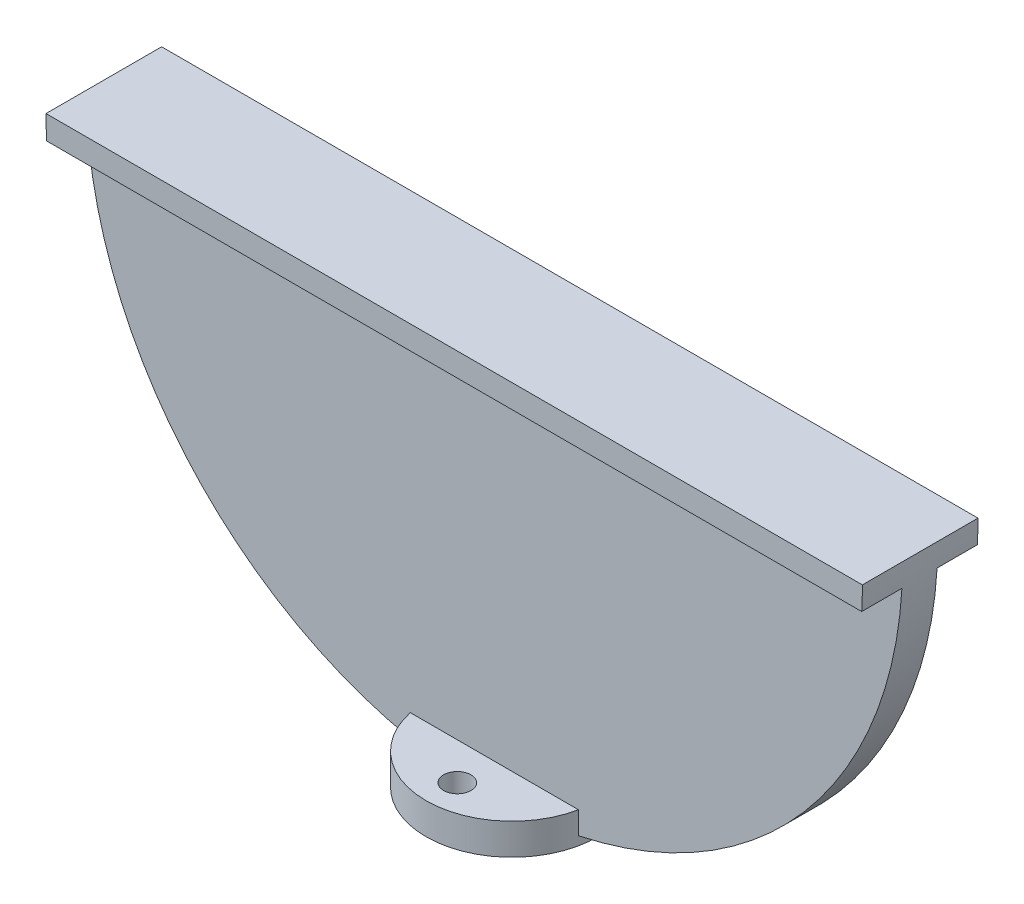
ISO-10303-21;
HEADER;
FILE_DESCRIPTION(('STEP AP214'),'2;1');
FILE_NAME('part.step','',(''),(''),'','','');
FILE_SCHEMA(('AUTOMOTIVE_DESIGN { 1 0 10303 214 1 1 1 1 }'));
ENDSEC;
DATA;
#1=APPLICATION_CONTEXT('core data for automotive mechanical design processes');
#2=APPLICATION_PROTOCOL_DEFINITION('international standard','automotive_design',2000,#1);
#3=PRODUCT_CONTEXT('',#1,'mechanical');
#4=PRODUCT('Part','Part','',(#3));
#5=PRODUCT_RELATED_PRODUCT_CATEGORY('part','',(#4));
#6=PRODUCT_DEFINITION_FORMATION('','',#4);
#7=PRODUCT_DEFINITION_CONTEXT('part definition',#1,'design');
#8=PRODUCT_DEFINITION('design','',#6,#7);
#9=PRODUCT_DEFINITION_SHAPE('','',#8);
#10=(LENGTH_UNIT() NAMED_UNIT(*) SI_UNIT(.MILLI.,.METRE.));
#11=(NAMED_UNIT(*) PLANE_ANGLE_UNIT() SI_UNIT($,.RADIAN.));
#12=(NAMED_UNIT(*) SI_UNIT($,.STERADIAN.) SOLID_ANGLE_UNIT());
#13=UNCERTAINTY_MEASURE_WITH_UNIT(LENGTH_MEASURE(1.E-05),#10,'distance_accuracy_value','');
#14=(GEOMETRIC_REPRESENTATION_CONTEXT(3) GLOBAL_UNCERTAINTY_ASSIGNED_CONTEXT((#13)) GLOBAL_UNIT_ASSIGNED_CONTEXT((#10,
#11,#12)) REPRESENTATION_CONTEXT('',''));
#15=CARTESIAN_POINT('',(0.,0.,0.));
#16=DIRECTION('',(0.,0.,1.));
#17=DIRECTION('',(1.,0.,0.));
#18=AXIS2_PLACEMENT_3D('',#15,#16,#17);
#19=CARTESIAN_POINT('',(0.,0.,4.5));
#20=DIRECTION('',(0.,0.,1.));
#21=DIRECTION('',(1.,0.,0.));
#22=AXIS2_PLACEMENT_3D('',#19,#20,#21);
#23=PLANE('',#22);
#24=CARTESIAN_POINT('',(0.,0.,4.5));
#25=DIRECTION('',(0.,0.,1.));
#26=DIRECTION('',(1.,0.,0.));
#27=AXIS2_PLACEMENT_3D('',#24,#25,#26);
#28=CIRCLE('',#27,52.25);
#29=CARTESIAN_POINT('',(-52.1638045008222,-3.,4.5));
#30=VERTEX_POINT('',#29);
#31=CARTESIAN_POINT('',(-10.767427733679,-51.1285145491241,4.5));
#32=VERTEX_POINT('',#31);
#33=EDGE_CURVE('E211',#30,#32,#28,.T.);
#34=ORIENTED_EDGE('',*,*,#33,.T.);
#35=DIRECTION('',(0.,-1.,0.));
#36=VECTOR('',#35,1.);
#37=CARTESIAN_POINT('',(-10.767427733679,-48.25,4.5));
#38=LINE('',#37,#36);
#39=CARTESIAN_POINT('',(-10.767427733679,-48.25,4.5));
#40=VERTEX_POINT('',#39);
#41=EDGE_CURVE('E51',#32,#40,#38,.F.);
#42=ORIENTED_EDGE('',*,*,#41,.T.);
#43=DIRECTION('',(-1.,0.,0.));
#44=VECTOR('',#43,1.);
#45=CARTESIAN_POINT('',(0.,-48.25,4.5));
#46=LINE('',#45,#44);
#47=CARTESIAN_POINT('',(10.767427733679,-48.25,4.5));
#48=VERTEX_POINT('',#47);
#49=EDGE_CURVE('E55',#48,#40,#46,.T.);
#50=ORIENTED_EDGE('',*,*,#49,.F.);
#51=DIRECTION('',(0.,-1.,0.));
#52=VECTOR('',#51,1.);
#53=CARTESIAN_POINT('',(10.767427733679,-48.25,4.5));
#54=LINE('',#53,#52);
#55=CARTESIAN_POINT('',(10.767427733679,-51.1285145491241,4.5));
#56=VERTEX_POINT('',#55);
#57=EDGE_CURVE('E224',#48,#56,#54,.T.);
#58=ORIENTED_EDGE('',*,*,#57,.T.);
#59=CARTESIAN_POINT('',(52.1638045008222,-3.,4.5));
#60=VERTEX_POINT('',#59);
#61=EDGE_CURVE('E121',#56,#60,#28,.T.);
#62=ORIENTED_EDGE('',*,*,#61,.T.);
#63=DIRECTION('',(-1.,0.,0.));
#64=VECTOR('',#63,1.);
#65=CARTESIAN_POINT('',(0.,-3.,4.5));
#66=LINE('',#65,#64);
#67=EDGE_CURVE('E209',#60,#30,#66,.T.);
#68=ORIENTED_EDGE('',*,*,#67,.T.);
#69=EDGE_LOOP('',(#34,#42,#50,#58,#62,#68));
#70=FACE_BOUND('',#69,.T.);
#71=ADVANCED_FACE('F35',(#70),#23,.T.);
#72=CARTESIAN_POINT('',(0.,0.,0.));
#73=DIRECTION('',(0.,0.,1.));
#74=DIRECTION('',(1.,0.,0.));
#75=AXIS2_PLACEMENT_3D('',#72,#73,#74);
#76=PLANE('',#75);
#77=DIRECTION('',(0.,-1.,0.));
#78=VECTOR('',#77,1.);
#79=CARTESIAN_POINT('',(-10.767427733679,-48.25,0.));
#80=LINE('',#79,#78);
#81=CARTESIAN_POINT('',(-10.767427733679,-51.1285145491241,0.));
#82=VERTEX_POINT('',#81);
#83=CARTESIAN_POINT('',(-10.767427733679,-48.25,0.));
#84=VERTEX_POINT('',#83);
#85=EDGE_CURVE('E125',#82,#84,#80,.F.);
#86=ORIENTED_EDGE('',*,*,#85,.F.);
#87=CARTESIAN_POINT('',(0.,0.,0.));
#88=DIRECTION('',(0.,0.,1.));
#89=DIRECTION('',(1.,0.,0.));
#90=AXIS2_PLACEMENT_3D('',#87,#88,#89);
#91=CIRCLE('',#90,52.25);
#92=CARTESIAN_POINT('',(-52.1638045008222,-3.,0.));
#93=VERTEX_POINT('',#92);
#94=EDGE_CURVE('E111',#93,#82,#91,.T.);
#95=ORIENTED_EDGE('',*,*,#94,.F.);
#96=DIRECTION('',(-1.,0.,0.));
#97=VECTOR('',#96,1.);
#98=CARTESIAN_POINT('',(0.,-3.,0.));
#99=LINE('',#98,#97);
#100=CARTESIAN_POINT('',(52.1638045008222,-3.,0.));
#101=VERTEX_POINT('',#100);
#102=EDGE_CURVE('E136',#101,#93,#99,.T.);
#103=ORIENTED_EDGE('',*,*,#102,.F.);
#104=CARTESIAN_POINT('',(10.767427733679,-51.1285145491241,0.));
#105=VERTEX_POINT('',#104);
#106=EDGE_CURVE('E122',#105,#101,#91,.T.);
#107=ORIENTED_EDGE('',*,*,#106,.F.);
#108=DIRECTION('',(0.,-1.,0.));
#109=VECTOR('',#108,1.);
#110=CARTESIAN_POINT('',(10.767427733679,-48.25,0.));
#111=LINE('',#110,#109);
#112=CARTESIAN_POINT('',(10.767427733679,-48.25,0.));
#113=VERTEX_POINT('',#112);
#114=EDGE_CURVE('E223',#113,#105,#111,.T.);
#115=ORIENTED_EDGE('',*,*,#114,.F.);
#116=DIRECTION('',(-1.,0.,0.));
#117=VECTOR('',#116,1.);
#118=CARTESIAN_POINT('',(0.,-48.25,0.));
#119=LINE('',#118,#117);
#120=EDGE_CURVE('E11',#113,#84,#119,.T.);
#121=ORIENTED_EDGE('',*,*,#120,.T.);
#122=EDGE_LOOP('',(#86,#95,#103,#107,#115,#121));
#123=FACE_BOUND('',#122,.T.);
#124=ADVANCED_FACE('F126',(#123),#76,.F.);
#125=CARTESIAN_POINT('',(0.,0.,4.5));
#126=DIRECTION('',(0.,0.,-1.));
#127=DIRECTION('',(-1.,0.,0.));
#128=AXIS2_PLACEMENT_3D('',#125,#126,#127);
#129=CYLINDRICAL_SURFACE('',#128,52.25);
#130=CARTESIAN_POINT('',(0.,-52.25,-8.75));
#131=CARTESIAN_POINT('',(0.30542774422126,-52.2500035044439,-8.75000661611907));
#132=CARTESIAN_POINT('',(0.610774800715626,-52.2473174153071,-8.73727613574851));
#133=CARTESIAN_POINT('',(1.21935049360583,-52.236655716327,-8.68646992622895));
#134=CARTESIAN_POINT('',(1.52257878683869,-52.228679268825,-8.64839018335382));
#135=CARTESIAN_POINT('',(2.12482973612014,-52.2076477981882,-8.54714878524386));
#136=CARTESIAN_POINT('',(2.42384952525128,-52.194589471687,-8.48397081488845));
#137=CARTESIAN_POINT('',(3.01537799316569,-52.1637585604862,-8.33303657364289));
#138=CARTESIAN_POINT('',(3.30788654057395,-52.14598588076,-8.24527980731944));
#139=CARTESIAN_POINT('',(3.88404113997619,-52.1062379626673,-8.04597259192359));
#140=CARTESIAN_POINT('',(4.16769607942561,-52.0842671074245,-7.93444694496716));
#141=CARTESIAN_POINT('',(4.72452773325203,-52.0367123139476,-7.68838475599573));
#142=CARTESIAN_POINT('',(4.99770436003278,-52.0111283455172,-7.55384802166465));
#143=CARTESIAN_POINT('',(5.53168740562185,-51.9570490409236,-7.26277458814556));
#144=CARTESIAN_POINT('',(5.79249661887698,-51.9285543670753,-7.10624289075782));
#145=CARTESIAN_POINT('',(6.30017769580982,-51.8694091386543,-6.77220176406812));
#146=CARTESIAN_POINT('',(6.54704493101329,-51.838757875631,-6.59468542805613));
#147=CARTESIAN_POINT('',(7.02830414528038,-51.7757194326662,-6.21744654761459));
#148=CARTESIAN_POINT('',(7.26248806738109,-51.7433146612874,-6.0174614710465));
#149=CARTESIAN_POINT('',(7.71323962127681,-51.6780447390069,-5.59860443211979));
#150=CARTESIAN_POINT('',(7.9298071120398,-51.6451795844221,-5.37973231858594));
#151=CARTESIAN_POINT('',(8.34392388732784,-51.5798933365753,-4.9245129970634));
#152=CARTESIAN_POINT('',(8.54146824600731,-51.5474723601829,-4.68816129077395));
#153=CARTESIAN_POINT('',(8.9160592544566,-51.4840021200619,-4.19969640125073));
#154=CARTESIAN_POINT('',(9.09311304732179,-51.4529523806629,-3.94758875808643));
#155=CARTESIAN_POINT('',(9.42728954258514,-51.3927801086111,-3.42653007410464));
#156=CARTESIAN_POINT('',(9.58418643026197,-51.3636809098344,-3.1574314340929));
#157=CARTESIAN_POINT('',(9.87471405207177,-51.308619113203,-2.60664144262729));
#158=CARTESIAN_POINT('',(10.0083445833153,-51.2826565427013,-2.32494998138723));
#159=CARTESIAN_POINT('',(10.2513062561535,-51.2346422310222,-1.75097841522664));
#160=CARTESIAN_POINT('',(10.3606394782575,-51.212590155033,-1.45869921939809));
#161=CARTESIAN_POINT('',(10.5541532056355,-51.1730604362124,-0.865628365787486));
#162=CARTESIAN_POINT('',(10.6383341287184,-51.1555827173961,-0.564836849495844));
#163=CARTESIAN_POINT('',(10.7798253311149,-51.1259524995149,0.0386588092648649));
#164=CARTESIAN_POINT('',(10.8375065742371,-51.1137266490955,0.341272395308378));
#165=CARTESIAN_POINT('',(10.9273014982731,-51.0946053477136,0.95043684996661));
#166=CARTESIAN_POINT('',(10.9594154018146,-51.0877098503368,1.25698768427409));
#167=CARTESIAN_POINT('',(10.9978073479132,-51.0794588934356,1.87174679817147));
#168=CARTESIAN_POINT('',(11.0040879630539,-51.0781028822667,2.17995490966202));
#169=CARTESIAN_POINT('',(10.9907676373281,-51.0809707584193,2.79578358824054));
#170=CARTESIAN_POINT('',(10.9711669396057,-51.0851945933205,3.10340416082099));
#171=CARTESIAN_POINT('',(10.906795641267,-51.0989761667235,3.71063559855589));
#172=CARTESIAN_POINT('',(10.8624541445181,-51.1084429514161,4.01029413911348));
#173=CARTESIAN_POINT('',(10.7492672424755,-51.1323683652679,4.60473911603598));
#174=CARTESIAN_POINT('',(10.6804221537197,-51.146826929943,4.89952561528657));
#175=CARTESIAN_POINT('',(10.5187615976709,-51.1803180916697,5.48219252442763));
#176=CARTESIAN_POINT('',(10.4259452665986,-51.199350853546,5.77007268504664));
#177=CARTESIAN_POINT('',(10.2170456282063,-51.2414463266731,6.33695872786808));
#178=CARTESIAN_POINT('',(10.1009620553881,-51.264509083909,6.61596450876455));
#179=CARTESIAN_POINT('',(9.84543400343754,-51.3141986728167,7.16526866771179));
#180=CARTESIAN_POINT('',(9.7058227319102,-51.3408506571807,7.43548716742986));
#181=CARTESIAN_POINT('',(9.40485214789984,-51.3968352503747,7.96323319957722));
#182=CARTESIAN_POINT('',(9.24349277277819,-51.4261678669253,8.22076069545113));
#183=CARTESIAN_POINT('',(8.90012905927569,-51.4867029850409,8.72146526361976));
#184=CARTESIAN_POINT('',(8.71812274654941,-51.5179056652943,8.96464096015035));
#185=CARTESIAN_POINT('',(8.33469963885511,-51.5813244419232,9.43504424103798));
#186=CARTESIAN_POINT('',(8.13328216264737,-51.6135405738393,9.66227126518827));
#187=CARTESIAN_POINT('',(7.70815638280629,-51.6787575048409,10.1036666844729));
#188=CARTESIAN_POINT('',(7.4840828716688,-51.7117611123056,10.3174830816465));
#189=CARTESIAN_POINT('',(7.01864237864466,-51.7769868766148,10.7255202827361));
#190=CARTESIAN_POINT('',(6.77727515699704,-51.8092090226167,10.9197408148838));
#191=CARTESIAN_POINT('',(6.27886839992299,-51.871971118821,11.2872384707379));
#192=CARTESIAN_POINT('',(6.02182828733027,-51.9025110069938,11.460514822457));
#193=CARTESIAN_POINT('',(5.49383823963621,-51.9610505747576,11.7848692610955));
#194=CARTESIAN_POINT('',(5.22288877241559,-51.9890503397052,11.9359480940322));
#195=CARTESIAN_POINT('',(4.6684092705646,-52.0417730890081,12.2150626525783));
#196=CARTESIAN_POINT('',(4.38485631352987,-52.0664897471469,12.3430540560951));
#197=CARTESIAN_POINT('',(3.80764455311428,-52.1118809904983,12.5746571170513));
#198=CARTESIAN_POINT('',(3.51398571372867,-52.1325555613081,12.6782686876212));
#199=CARTESIAN_POINT('',(2.918705242908,-52.1692684262469,12.8602789585233));
#200=CARTESIAN_POINT('',(2.61708448798209,-52.1853072284132,12.9386804217563));
#201=CARTESIAN_POINT('',(2.00806126279999,-52.2122886576251,13.0696441709258));
#202=CARTESIAN_POINT('',(1.70065889178173,-52.223231372059,13.1222068999492));
#203=CARTESIAN_POINT('',(1.0880731287604,-52.2395515038219,13.2003274793452));
#204=CARTESIAN_POINT('',(0.782953618078995,-52.2450279782447,13.2263661739831));
#205=CARTESIAN_POINT('',(0.171558460256514,-52.2506126327035,13.2529174060698));
#206=CARTESIAN_POINT('',(-0.134717172628346,-52.2507208787207,13.2534302572577));
#207=CARTESIAN_POINT('',(-0.746180929536525,-52.2455662253439,13.2289267258729));
#208=CARTESIAN_POINT('',(-1.05136911604556,-52.2403036397255,13.2039118346855));
#209=CARTESIAN_POINT('',(-1.6584653096944,-52.2245555110201,13.1285593352274));
#210=CARTESIAN_POINT('',(-1.96037332437138,-52.2140699799369,13.0782217851558));
#211=CARTESIAN_POINT('',(-2.55571930805514,-52.1883002817393,12.9532648517305));
#212=CARTESIAN_POINT('',(-2.84921201967738,-52.1730656352523,12.8788957729502));
#213=CARTESIAN_POINT('',(-3.42882776000708,-52.1381812009577,12.7063174468561));
#214=CARTESIAN_POINT('',(-3.71495085412908,-52.1185314523548,12.6081084112323));
#215=CARTESIAN_POINT('',(-4.27789938009257,-52.0753471835529,12.388582666466));
#216=CARTESIAN_POINT('',(-4.55472437388898,-52.051812480637,12.2672648704322));
#217=CARTESIAN_POINT('',(-5.09722992227253,-52.001490101594,12.002403267025));
#218=CARTESIAN_POINT('',(-5.36291002615748,-51.9747022940807,11.858858561889));
#219=CARTESIAN_POINT('',(-5.88484469005448,-51.9182138560963,11.5484952999468));
#220=CARTESIAN_POINT('',(-6.140925912903,-51.8884790928838,11.3813914365867));
#221=CARTESIAN_POINT('',(-6.63815550277959,-51.8272144070494,11.0265698703684));
#222=CARTESIAN_POINT('',(-6.87930375733147,-51.7956844709095,10.8388520122739));
#223=CARTESIAN_POINT('',(-7.34510996018878,-51.7316841544259,10.4440575803501));
#224=CARTESIAN_POINT('',(-7.56976597768615,-51.6992136645866,10.2369787462906));
#225=CARTESIAN_POINT('',(-8.00107375938886,-51.6342221144019,9.80486637847805));
#226=CARTESIAN_POINT('',(-8.20772578052985,-51.6017010547851,9.57983310104129));
#227=CARTESIAN_POINT('',(-8.60501076089678,-51.5369527173713,9.10931475492592));
#228=CARTESIAN_POINT('',(-8.7953111566348,-51.5047398638583,8.86354675341181));
#229=CARTESIAN_POINT('',(-9.15453539138605,-51.4421056871545,8.35663441285027));
#230=CARTESIAN_POINT('',(-9.32345895711101,-51.4116843868701,8.09548987728681));
#231=CARTESIAN_POINT('',(-9.63870244777168,-51.3535161197911,7.55961813904119));
#232=CARTESIAN_POINT('',(-9.78502296188356,-51.3257690832956,7.2848912906451));
#233=CARTESIAN_POINT('',(-10.0539695587961,-51.2737649106075,6.72375612970254));
#234=CARTESIAN_POINT('',(-10.1765958960511,-51.2495077369376,6.43734794264328));
#235=CARTESIAN_POINT('',(-10.3965963064884,-51.2053299373665,5.85648074150399));
#236=CARTESIAN_POINT('',(-10.4941059230356,-51.185386132028,5.56207484211089));
#237=CARTESIAN_POINT('',(-10.6639789663353,-51.1502647615728,4.96581399347586));
#238=CARTESIAN_POINT('',(-10.7363424394269,-51.1350871876731,4.66395905796202));
#239=CARTESIAN_POINT('',(-10.8553238659169,-51.1099613289033,4.05503918335708));
#240=CARTESIAN_POINT('',(-10.9019449878736,-51.1000124004602,3.74797489026993));
#241=CARTESIAN_POINT('',(-10.9690646270815,-51.0856467618078,3.13087744282423));
#242=CARTESIAN_POINT('',(-10.9895635615423,-51.0812299632423,2.82084433596166));
#243=CARTESIAN_POINT('',(-11.0041186292738,-51.078096306685,2.20639638083131));
#244=CARTESIAN_POINT('',(-10.9987000868022,-51.0792662104069,1.9019944268027));
#245=CARTESIAN_POINT('',(-10.962664781535,-51.0870122435083,1.29475842862829));
#246=CARTESIAN_POINT('',(-10.932048377934,-51.0935882958234,0.991924362194234));
#247=CARTESIAN_POINT('',(-10.845866433865,-51.1119518008377,0.389995066366881));
#248=CARTESIAN_POINT('',(-10.7903012909264,-51.1237391705006,0.0908997774785291));
#249=CARTESIAN_POINT('',(-10.6546644476655,-51.1521790335111,-0.501443990764038));
#250=CARTESIAN_POINT('',(-10.5745926401487,-51.1688315481393,-0.794692444537634));
#251=CARTESIAN_POINT('',(-10.3908414075336,-51.206461249153,-1.37243407358907));
#252=CARTESIAN_POINT('',(-10.287233581045,-51.2274253015278,-1.65695089147018));
#253=CARTESIAN_POINT('',(-10.0570531679615,-51.2731112662195,-2.21622035210235));
#254=CARTESIAN_POINT('',(-9.93048067747221,-51.29783316281,-2.49097303570994));
#255=CARTESIAN_POINT('',(-9.65530094547716,-51.350338560903,-3.02886519746426));
#256=CARTESIAN_POINT('',(-9.50669613592566,-51.3781217244122,-3.29200595319512));
#257=CARTESIAN_POINT('',(-9.18841978843759,-51.4359952079237,-3.8050902605092));
#258=CARTESIAN_POINT('',(-9.01874026422527,-51.4660864008928,-4.05502875763722));
#259=CARTESIAN_POINT('',(-8.65620364009981,-51.5283132951291,-4.54445171407985));
#260=CARTESIAN_POINT('',(-8.46297803452258,-51.5604763991519,-4.7836597972175));
#261=CARTESIAN_POINT('',(-8.05714406416598,-51.6254507704221,-5.2451242491547));
#262=CARTESIAN_POINT('',(-7.84452688848178,-51.6582623269483,-5.46737282701746));
#263=CARTESIAN_POINT('',(-7.40136128848284,-51.723616615635,-5.8933615096945));
#264=CARTESIAN_POINT('',(-7.17080876416751,-51.7561592844361,-6.09709735930589));
#265=CARTESIAN_POINT('',(-6.69346058877045,-51.8200543716527,-6.48453123187444));
#266=CARTESIAN_POINT('',(-6.44667228721434,-51.8514073186275,-6.66823822266965));
#267=CARTESIAN_POINT('',(-5.93527851514947,-51.9124462323001,-7.01657160398456));
#268=CARTESIAN_POINT('',(-5.6704914899683,-51.9421070056633,-7.18093603194224));
#269=CARTESIAN_POINT('',(-5.12779204780584,-51.9984869538259,-7.48666873877052));
#270=CARTESIAN_POINT('',(-4.8498845818632,-52.0252072257528,-7.62804560397382));
#271=CARTESIAN_POINT('',(-4.28294425190179,-52.0749437711294,-7.8867348732868));
#272=CARTESIAN_POINT('',(-3.99391783957973,-52.0979621535742,-8.00406098983358));
#273=CARTESIAN_POINT('',(-3.40676099342191,-52.1396507928959,-8.21380455642121));
#274=CARTESIAN_POINT('',(-3.10863225322209,-52.1583218531528,-8.30622660920022));
#275=CARTESIAN_POINT('',(-2.35003165323887,-52.1991253588719,-8.50641272407588));
#276=CARTESIAN_POINT('',(-1.8849121253758,-52.2181006147286,-8.59762720646657));
#277=CARTESIAN_POINT('',(-0.946463646128785,-52.2435349806031,-8.71941455548049));
#278=CARTESIAN_POINT('',(-0.473135010731013,-52.2499945713016,-8.74998975103727));
#279=CARTESIAN_POINT('',(0.,-52.25,-8.75));
#280=B_SPLINE_CURVE_WITH_KNOTS('',3,(#130,#131,#132,#133,#134,#135,#136,#137,#138,#139,#140,
#141,#142,#143,#144,#145,#146,#147,#148,#149,#150,#151,#152,#153,#154,#155,#156,#157,#158,#159,
#160,#161,#162,#163,#164,#165,#166,#167,#168,#169,#170,#171,#172,#173,#174,#175,#176,#177,#178,
#179,#180,#181,#182,#183,#184,#185,#186,#187,#188,#189,#190,#191,#192,#193,#194,#195,#196,#197,
#198,#199,#200,#201,#202,#203,#204,#205,#206,#207,#208,#209,#210,#211,#212,#213,#214,#215,#216,
#217,#218,#219,#220,#221,#222,#223,#224,#225,#226,#227,#228,#229,#230,#231,#232,#233,#234,#235,
#236,#237,#238,#239,#240,#241,#242,#243,#244,#245,#246,#247,#248,#249,#250,#251,#252,#253,#254,
#255,#256,#257,#258,#259,#260,#261,#262,#263,#264,#265,#266,#267,#268,#269,#270,#271,#272,#273,
#274,#275,#276,#277,#278,#279),.UNSPECIFIED.,.T.,.F.,(4,2,2,2,2,2,2,2,2,2,2,2,2,2,2,2,2,2,2,2,2,
2,2,2,2,2,2,2,2,2,2,2,2,2,2,2,2,2,2,2,2,2,2,2,2,2,2,2,2,2,2,2,2,2,2,2,2,2,2,2,2,2,2,2,2,2,2,2,2,
2,2,2,2,2,4),(0.,0.915867498507801,1.83188004722926,2.74848902747883,3.66511648508966,
4.58079211178143,5.49647539164203,6.41195077505002,7.3277283137865,8.25561192483753,
9.18350296352425,10.1116336276594,11.0394397607763,11.9768707613942,12.9143099362765,
13.8516688099587,14.789012112155,15.7128008232243,16.636581490309,17.5602701613376,
18.4839501547624,19.3920866692063,20.3002114527472,21.2083689642019,22.1165368390607,
23.0314368401208,23.9463394763219,24.8613296731554,25.7763519935051,26.7096720569968,
27.643005062596,28.5763724596856,29.5097084808544,30.4448176347325,31.3799301205163,
32.3149400877215,33.249934020667,34.1676587852892,35.0853722701183,36.0030321432322,
36.9206899073016,37.829082116506,38.7374662598196,39.6458931383865,40.5543567186198,
41.4749568644001,42.3955639433627,43.3162786299326,44.2369801747989,45.1733542969748,
46.1097403888499,47.046102068557,47.9824536920118,48.9136410684329,49.8448267288628,
50.7758977465378,51.7069538934584,52.6192192787901,53.5314716600355,54.4437095061088,
55.3559513424588,56.2654543662155,57.1749535838481,58.0843524844856,58.9940970598891,
59.9205532739904,60.8474325572659,61.7745243502803,62.7011993221537,63.6392519014895,
64.5769532897561,65.514118555206,66.4511104959505,67.8699260111704,69.2886870338127),.UNSPECIFIED.);
#281=EDGE_CURVE('E44',#105,#56,#280,.T.);
#282=ORIENTED_EDGE('',*,*,#281,.F.);
#283=ORIENTED_EDGE('',*,*,#106,.T.);
#284=DIRECTION('',(0.,0.,-1.));
#285=VECTOR('',#284,1.);
#286=CARTESIAN_POINT('',(52.1638045008222,-3.,9.65));
#287=LINE('',#286,#285);
#288=CARTESIAN_POINT('',(52.1638045008222,-3.,-5.15));
#289=VERTEX_POINT('',#288);
#290=EDGE_CURVE('E190',#101,#289,#287,.T.);
#291=ORIENTED_EDGE('',*,*,#290,.T.);
#292=CARTESIAN_POINT('',(0.,0.,-5.15));
#293=DIRECTION('',(0.,0.,1.));
#294=DIRECTION('',(1.,0.,0.));
#295=AXIS2_PLACEMENT_3D('',#292,#293,#294);
#296=CIRCLE('',#295,52.25);
#297=CARTESIAN_POINT('',(52.25,0.,-5.15));
#298=VERTEX_POINT('',#297);
#299=EDGE_CURVE('E188',#289,#298,#296,.T.);
#300=ORIENTED_EDGE('',*,*,#299,.T.);
#301=DIRECTION('',(0.,0.,-1.));
#302=VECTOR('',#301,1.);
#303=CARTESIAN_POINT('',(52.25,0.,4.5));
#304=LINE('',#303,#302);
#305=CARTESIAN_POINT('',(52.25,0.,9.65));
#306=VERTEX_POINT('',#305);
#307=EDGE_CURVE('E138',#306,#298,#304,.T.);
#308=ORIENTED_EDGE('',*,*,#307,.F.);
#309=CARTESIAN_POINT('',(0.,0.,9.65));
#310=DIRECTION('',(0.,0.,1.));
#311=DIRECTION('',(1.,0.,0.));
#312=AXIS2_PLACEMENT_3D('',#309,#310,#311);
#313=CIRCLE('',#312,52.25);
#314=CARTESIAN_POINT('',(52.1638045008222,-3.,9.65));
#315=VERTEX_POINT('',#314);
#316=EDGE_CURVE('E215',#315,#306,#313,.T.);
#317=ORIENTED_EDGE('',*,*,#316,.F.);
#318=EDGE_CURVE('E203',#315,#60,#287,.T.);
#319=ORIENTED_EDGE('',*,*,#318,.T.);
#320=ORIENTED_EDGE('',*,*,#61,.F.);
#321=EDGE_LOOP('',(#282,#283,#291,#300,#308,#317,#319,#320));
#322=FACE_BOUND('',#321,.T.);
#323=ADVANCED_FACE('F37',(#322),#129,.T.);
#324=EDGE_CURVE('E116',#32,#82,#280,.T.);
#325=ORIENTED_EDGE('',*,*,#324,.F.);
#326=ORIENTED_EDGE('',*,*,#33,.F.);
#327=DIRECTION('',(0.,0.,-1.));
#328=VECTOR('',#327,1.);
#329=CARTESIAN_POINT('',(-52.1638045008222,-3.,9.65));
#330=LINE('',#329,#328);
#331=CARTESIAN_POINT('',(-52.1638045008222,-3.,9.65));
#332=VERTEX_POINT('',#331);
#333=EDGE_CURVE('E206',#332,#30,#330,.T.);
#334=ORIENTED_EDGE('',*,*,#333,.F.);
#335=CARTESIAN_POINT('',(0.,0.,9.65));
#336=DIRECTION('',(0.,0.,1.));
#337=DIRECTION('',(1.,0.,0.));
#338=AXIS2_PLACEMENT_3D('',#335,#336,#337);
#339=CIRCLE('',#338,52.25);
#340=CARTESIAN_POINT('',(-52.25,0.,9.65));
#341=VERTEX_POINT('',#340);
#342=EDGE_CURVE('E196',#341,#332,#339,.T.);
#343=ORIENTED_EDGE('',*,*,#342,.F.);
#344=DIRECTION('',(0.,0.,-1.));
#345=VECTOR('',#344,1.);
#346=CARTESIAN_POINT('',(-52.25,0.,4.5));
#347=LINE('',#346,#345);
#348=CARTESIAN_POINT('',(-52.25,0.,-5.15));
#349=VERTEX_POINT('',#348);
#350=EDGE_CURVE('E186',#341,#349,#347,.T.);
#351=ORIENTED_EDGE('',*,*,#350,.T.);
#352=CARTESIAN_POINT('',(0.,0.,-5.15));
#353=DIRECTION('',(0.,0.,1.));
#354=DIRECTION('',(1.,0.,0.));
#355=AXIS2_PLACEMENT_3D('',#352,#353,#354);
#356=CIRCLE('',#355,52.25);
#357=CARTESIAN_POINT('',(-52.1638045008222,-3.,-5.15));
#358=VERTEX_POINT('',#357);
#359=EDGE_CURVE('E195',#349,#358,#356,.T.);
#360=ORIENTED_EDGE('',*,*,#359,.T.);
#361=EDGE_CURVE('E118',#93,#358,#330,.T.);
#362=ORIENTED_EDGE('',*,*,#361,.F.);
#363=ORIENTED_EDGE('',*,*,#94,.T.);
#364=EDGE_LOOP('',(#325,#326,#334,#343,#351,#360,#362,#363));
#365=FACE_BOUND('',#364,.T.);
#366=ADVANCED_FACE('F113',(#365),#129,.T.);
#367=CARTESIAN_POINT('',(-52.25,0.,4.5));
#368=DIRECTION('',(0.,-1.,0.));
#369=DIRECTION('',(0.,0.,-1.));
#370=AXIS2_PLACEMENT_3D('',#367,#368,#369);
#371=PLANE('',#370);
#372=ORIENTED_EDGE('',*,*,#307,.T.);
#373=DIRECTION('',(-1.,0.,0.));
#374=VECTOR('',#373,1.);
#375=CARTESIAN_POINT('',(-52.25,0.,-5.15));
#376=LINE('',#375,#374);
#377=EDGE_CURVE('E179',#298,#349,#376,.T.);
#378=ORIENTED_EDGE('',*,*,#377,.T.);
#379=ORIENTED_EDGE('',*,*,#350,.F.);
#380=DIRECTION('',(-1.,0.,0.));
#381=VECTOR('',#380,1.);
#382=CARTESIAN_POINT('',(-52.25,0.,9.65));
#383=LINE('',#382,#381);
#384=EDGE_CURVE('E182',#306,#341,#383,.T.);
#385=ORIENTED_EDGE('',*,*,#384,.F.);
#386=EDGE_LOOP('',(#372,#378,#379,#385));
#387=FACE_BOUND('',#386,.T.);
#388=ADVANCED_FACE('F162',(#387),#371,.F.);
#389=CARTESIAN_POINT('',(0.,0.,-5.15));
#390=DIRECTION('',(0.,0.,1.));
#391=DIRECTION('',(1.,0.,0.));
#392=AXIS2_PLACEMENT_3D('',#389,#390,#391);
#393=PLANE('',#392);
#394=ORIENTED_EDGE('',*,*,#359,.F.);
#395=ORIENTED_EDGE('',*,*,#377,.F.);
#396=ORIENTED_EDGE('',*,*,#299,.F.);
#397=DIRECTION('',(1.,0.,0.));
#398=VECTOR('',#397,1.);
#399=CARTESIAN_POINT('',(-52.1638045008222,-3.,-5.15));
#400=LINE('',#399,#398);
#401=EDGE_CURVE('E193',#358,#289,#400,.T.);
#402=ORIENTED_EDGE('',*,*,#401,.F.);
#403=EDGE_LOOP('',(#394,#395,#396,#402));
#404=FACE_BOUND('',#403,.T.);
#405=ADVANCED_FACE('F158',(#404),#393,.F.);
#406=CARTESIAN_POINT('',(-52.1638045008222,-3.,9.65));
#407=DIRECTION('',(0.,1.,0.));
#408=DIRECTION('',(0.,0.,1.));
#409=AXIS2_PLACEMENT_3D('',#406,#407,#408);
#410=PLANE('',#409);
#411=ORIENTED_EDGE('',*,*,#290,.F.);
#412=ORIENTED_EDGE('',*,*,#102,.T.);
#413=ORIENTED_EDGE('',*,*,#361,.T.);
#414=ORIENTED_EDGE('',*,*,#401,.T.);
#415=EDGE_LOOP('',(#411,#412,#413,#414));
#416=FACE_BOUND('',#415,.T.);
#417=ADVANCED_FACE('F161',(#416),#410,.F.);
#418=ORIENTED_EDGE('',*,*,#67,.F.);
#419=ORIENTED_EDGE('',*,*,#318,.F.);
#420=DIRECTION('',(1.,0.,0.));
#421=VECTOR('',#420,1.);
#422=CARTESIAN_POINT('',(-52.1638045008222,-3.,9.65));
#423=LINE('',#422,#421);
#424=EDGE_CURVE('E199',#332,#315,#423,.T.);
#425=ORIENTED_EDGE('',*,*,#424,.F.);
#426=ORIENTED_EDGE('',*,*,#333,.T.);
#427=EDGE_LOOP('',(#418,#419,#425,#426));
#428=FACE_BOUND('',#427,.T.);
#429=ADVANCED_FACE('F156',(#428),#410,.F.);
#430=CARTESIAN_POINT('',(0.,0.,9.65));
#431=DIRECTION('',(0.,0.,1.));
#432=DIRECTION('',(1.,0.,0.));
#433=AXIS2_PLACEMENT_3D('',#430,#431,#432);
#434=PLANE('',#433);
#435=ORIENTED_EDGE('',*,*,#342,.T.);
#436=ORIENTED_EDGE('',*,*,#424,.T.);
#437=ORIENTED_EDGE('',*,*,#316,.T.);
#438=ORIENTED_EDGE('',*,*,#384,.T.);
#439=EDGE_LOOP('',(#435,#436,#437,#438));
#440=FACE_BOUND('',#439,.T.);
#441=ADVANCED_FACE('F153',(#440),#434,.T.);
#442=CARTESIAN_POINT('',(0.,-48.25,2.25));
#443=DIRECTION('',(0.,1.,0.));
#444=DIRECTION('',(0.,0.,1.));
#445=AXIS2_PLACEMENT_3D('',#442,#443,#444);
#446=PLANE('',#445);
#447=CARTESIAN_POINT('',(0.,-48.25,-4.75));
#448=DIRECTION('',(0.,1.,0.));
#449=DIRECTION('',(0.,0.,1.));
#450=AXIS2_PLACEMENT_3D('',#447,#448,#449);
#451=CIRCLE('',#450,1.75);
#452=CARTESIAN_POINT('',(0.,-48.25,-3.));
#453=VERTEX_POINT('',#452);
#454=EDGE_CURVE('E241',#453,#453,#451,.F.);
#455=ORIENTED_EDGE('',*,*,#454,.T.);
#456=EDGE_LOOP('',(#455));
#457=FACE_BOUND('',#456,.T.);
#458=ORIENTED_EDGE('',*,*,#120,.F.);
#459=CARTESIAN_POINT('',(0.,-48.25,2.25));
#460=DIRECTION('',(0.,1.,0.));
#461=DIRECTION('',(0.,0.,1.));
#462=AXIS2_PLACEMENT_3D('',#459,#460,#461);
#463=CIRCLE('',#462,11.);
#464=EDGE_CURVE('E131',#113,#84,#463,.T.);
#465=ORIENTED_EDGE('',*,*,#464,.T.);
#466=EDGE_LOOP('',(#458,#465));
#467=FACE_BOUND('',#466,.T.);
#468=ADVANCED_FACE('F150',(#457,#467),#446,.T.);
#469=CARTESIAN_POINT('',(0.,-48.25,2.25));
#470=DIRECTION('',(0.,-1.,0.));
#471=DIRECTION('',(0.,0.,-1.));
#472=AXIS2_PLACEMENT_3D('',#469,#470,#471);
#473=CYLINDRICAL_SURFACE('',#472,11.);
#474=ORIENTED_EDGE('',*,*,#57,.F.);
#475=EDGE_CURVE('E233',#40,#48,#463,.T.);
#476=ORIENTED_EDGE('',*,*,#475,.F.);
#477=ORIENTED_EDGE('',*,*,#41,.F.);
#478=ORIENTED_EDGE('',*,*,#324,.T.);
#479=ORIENTED_EDGE('',*,*,#85,.T.);
#480=ORIENTED_EDGE('',*,*,#464,.F.);
#481=ORIENTED_EDGE('',*,*,#114,.T.);
#482=ORIENTED_EDGE('',*,*,#281,.T.);
#483=EDGE_LOOP('',(#474,#476,#477,#478,#479,#480,#481,#482));
#484=FACE_BOUND('',#483,.T.);
#485=CARTESIAN_POINT('',(0.,-52.25,2.25));
#486=DIRECTION('',(0.,1.,0.));
#487=DIRECTION('',(0.,0.,1.));
#488=AXIS2_PLACEMENT_3D('',#485,#486,#487);
#489=CIRCLE('',#488,11.);
#490=CARTESIAN_POINT('',(0.,-52.25,13.25));
#491=VERTEX_POINT('',#490);
#492=EDGE_CURVE('E235',#491,#491,#489,.T.);
#493=ORIENTED_EDGE('',*,*,#492,.T.);
#494=EDGE_LOOP('',(#493));
#495=FACE_BOUND('',#494,.T.);
#496=ADVANCED_FACE('F133',(#484,#495),#473,.T.);
#497=CARTESIAN_POINT('',(0.,-48.25,9.25));
#498=DIRECTION('',(0.,1.,0.));
#499=DIRECTION('',(0.,0.,1.));
#500=AXIS2_PLACEMENT_3D('',#497,#498,#499);
#501=CIRCLE('',#500,1.75);
#502=CARTESIAN_POINT('',(0.,-48.25,11.));
#503=VERTEX_POINT('',#502);
#504=EDGE_CURVE('E247',#503,#503,#501,.F.);
#505=ORIENTED_EDGE('',*,*,#504,.T.);
#506=EDGE_LOOP('',(#505));
#507=FACE_BOUND('',#506,.T.);
#508=ORIENTED_EDGE('',*,*,#475,.T.);
#509=ORIENTED_EDGE('',*,*,#49,.T.);
#510=EDGE_LOOP('',(#508,#509));
#511=FACE_BOUND('',#510,.T.);
#512=ADVANCED_FACE('F149',(#507,#511),#446,.T.);
#513=CARTESIAN_POINT('',(0.,-52.25,2.25));
#514=DIRECTION('',(0.,1.,0.));
#515=DIRECTION('',(0.,0.,1.));
#516=AXIS2_PLACEMENT_3D('',#513,#514,#515);
#517=PLANE('',#516);
#518=CARTESIAN_POINT('',(0.,-52.25,9.25));
#519=DIRECTION('',(0.,-1.,0.));
#520=DIRECTION('',(0.,0.,-1.));
#521=AXIS2_PLACEMENT_3D('',#518,#519,#520);
#522=CIRCLE('',#521,1.75);
#523=CARTESIAN_POINT('',(0.,-52.25,7.5));
#524=VERTEX_POINT('',#523);
#525=EDGE_CURVE('E238',#524,#524,#522,.T.);
#526=ORIENTED_EDGE('',*,*,#525,.F.);
#527=EDGE_LOOP('',(#526));
#528=FACE_BOUND('',#527,.T.);
#529=CARTESIAN_POINT('',(0.,-52.25,-4.75));
#530=DIRECTION('',(0.,-1.,0.));
#531=DIRECTION('',(0.,0.,-1.));
#532=AXIS2_PLACEMENT_3D('',#529,#530,#531);
#533=CIRCLE('',#532,1.75);
#534=CARTESIAN_POINT('',(0.,-52.25,-6.5));
#535=VERTEX_POINT('',#534);
#536=EDGE_CURVE('E244',#535,#535,#533,.T.);
#537=ORIENTED_EDGE('',*,*,#536,.F.);
#538=EDGE_LOOP('',(#537));
#539=FACE_BOUND('',#538,.T.);
#540=ORIENTED_EDGE('',*,*,#492,.F.);
#541=EDGE_LOOP('',(#540));
#542=FACE_BOUND('',#541,.T.);
#543=ADVANCED_FACE('F151',(#528,#539,#542),#517,.F.);
#544=CARTESIAN_POINT('',(0.,0.001000000000001,-4.75));
#545=DIRECTION('',(0.,-1.,0.));
#546=DIRECTION('',(0.,0.,-1.));
#547=AXIS2_PLACEMENT_3D('',#544,#545,#546);
#548=CYLINDRICAL_SURFACE('',#547,1.75);
#549=ORIENTED_EDGE('',*,*,#454,.F.);
#550=EDGE_LOOP('',(#549));
#551=FACE_BOUND('',#550,.T.);
#552=ORIENTED_EDGE('',*,*,#536,.T.);
#553=EDGE_LOOP('',(#552));
#554=FACE_BOUND('',#553,.T.);
#555=ADVANCED_FACE('F257',(#551,#554),#548,.F.);
#556=CARTESIAN_POINT('',(0.,0.001000000000001,9.25));
#557=DIRECTION('',(0.,-1.,0.));
#558=DIRECTION('',(0.,0.,-1.));
#559=AXIS2_PLACEMENT_3D('',#556,#557,#558);
#560=CYLINDRICAL_SURFACE('',#559,1.75);
#561=ORIENTED_EDGE('',*,*,#504,.F.);
#562=EDGE_LOOP('',(#561));
#563=FACE_BOUND('',#562,.T.);
#564=ORIENTED_EDGE('',*,*,#525,.T.);
#565=EDGE_LOOP('',(#564));
#566=FACE_BOUND('',#565,.T.);
#567=ADVANCED_FACE('F253',(#563,#566),#560,.F.);
#568=CLOSED_SHELL('',(#71,#124,#323,#366,#388,#405,#417,#429,#441,#468,#496,#512,#543,#555,#567));
#569=MANIFOLD_SOLID_BREP('B2',#568);
#570=ADVANCED_BREP_SHAPE_REPRESENTATION('',(#18,#569),#14);
#571=SHAPE_DEFINITION_REPRESENTATION(#9,#570);
ENDSEC;
END-ISO-10303-21;
